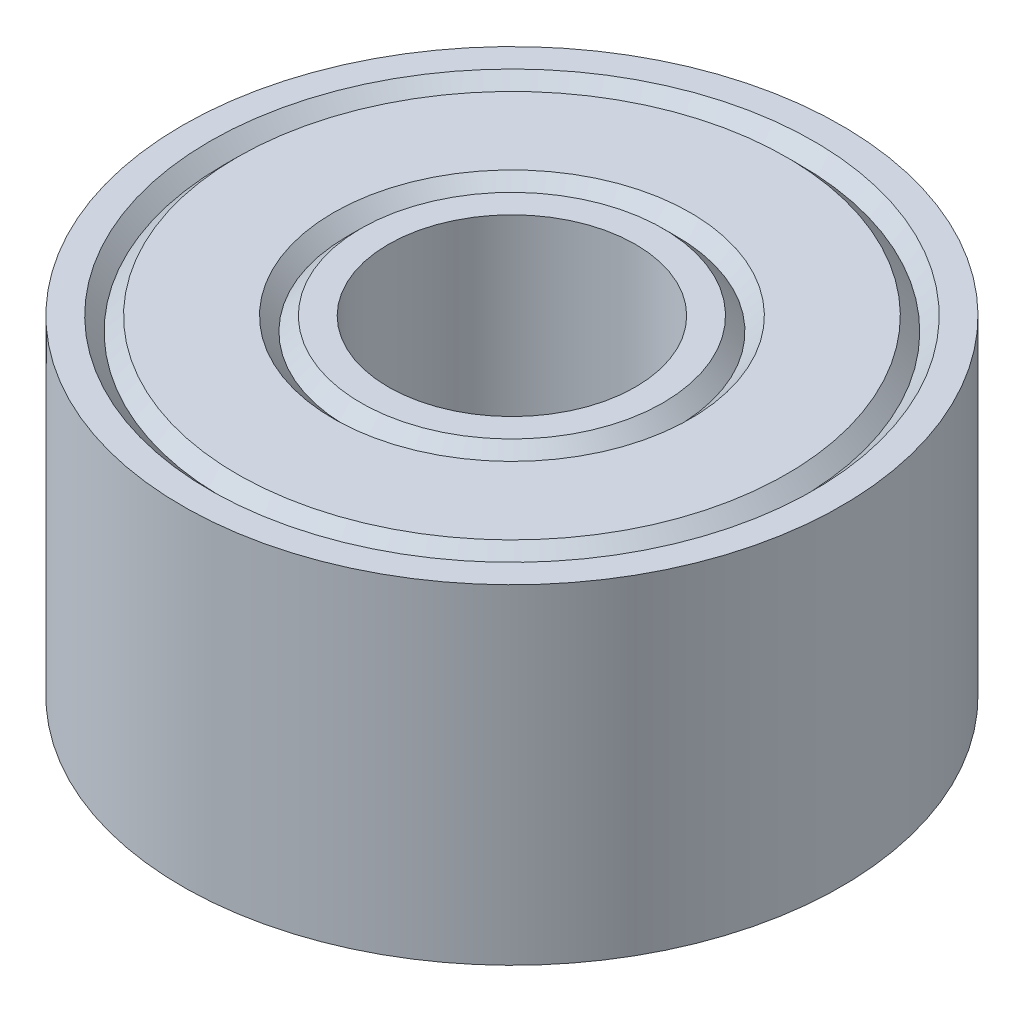
ISO-10303-21;
HEADER;
FILE_DESCRIPTION(('STEP AP214'),'2;1');
FILE_NAME('part.step','',(''),(''),'','','');
FILE_SCHEMA(('AUTOMOTIVE_DESIGN { 1 0 10303 214 1 1 1 1 }'));
ENDSEC;
DATA;
#1=APPLICATION_CONTEXT('core data for automotive mechanical design processes');
#2=APPLICATION_PROTOCOL_DEFINITION('international standard','automotive_design',2000,#1);
#3=PRODUCT_CONTEXT('',#1,'mechanical');
#4=PRODUCT('Part','Part','',(#3));
#5=PRODUCT_RELATED_PRODUCT_CATEGORY('part','',(#4));
#6=PRODUCT_DEFINITION_FORMATION('','',#4);
#7=PRODUCT_DEFINITION_CONTEXT('part definition',#1,'design');
#8=PRODUCT_DEFINITION('design','',#6,#7);
#9=PRODUCT_DEFINITION_SHAPE('','',#8);
#10=(LENGTH_UNIT() NAMED_UNIT(*) SI_UNIT(.MILLI.,.METRE.));
#11=(NAMED_UNIT(*) PLANE_ANGLE_UNIT() SI_UNIT($,.RADIAN.));
#12=(NAMED_UNIT(*) SI_UNIT($,.STERADIAN.) SOLID_ANGLE_UNIT());
#13=UNCERTAINTY_MEASURE_WITH_UNIT(LENGTH_MEASURE(1.E-05),#10,'distance_accuracy_value','');
#14=(GEOMETRIC_REPRESENTATION_CONTEXT(3) GLOBAL_UNCERTAINTY_ASSIGNED_CONTEXT((#13)) GLOBAL_UNIT_ASSIGNED_CONTEXT((#10,
#11,#12)) REPRESENTATION_CONTEXT('',''));
#15=CARTESIAN_POINT('',(0.,0.,0.));
#16=DIRECTION('',(0.,0.,1.));
#17=DIRECTION('',(1.,0.,0.));
#18=AXIS2_PLACEMENT_3D('',#15,#16,#17);
#19=CARTESIAN_POINT('',(0.,2.,0.));
#20=DIRECTION('',(0.,1.,0.));
#21=DIRECTION('',(-1.,0.,0.));
#22=AXIS2_PLACEMENT_3D('',#19,#20,#21);
#23=CYLINDRICAL_SURFACE('',#22,1.5);
#24=CARTESIAN_POINT('',(0.,2.,0.));
#25=DIRECTION('',(0.,1.,0.));
#26=DIRECTION('',(-1.,0.,0.));
#27=AXIS2_PLACEMENT_3D('',#24,#25,#26);
#28=CIRCLE('',#27,1.5);
#29=CARTESIAN_POINT('',(-1.5,2.,0.));
#30=VERTEX_POINT('',#29);
#31=EDGE_CURVE('E83',#30,#30,#28,.T.);
#32=ORIENTED_EDGE('',*,*,#31,.T.);
#33=EDGE_LOOP('',(#32));
#34=FACE_BOUND('',#33,.T.);
#35=CARTESIAN_POINT('',(0.,-2.,0.));
#36=DIRECTION('',(0.,1.,0.));
#37=DIRECTION('',(-1.,0.,0.));
#38=AXIS2_PLACEMENT_3D('',#35,#36,#37);
#39=CIRCLE('',#38,1.5);
#40=CARTESIAN_POINT('',(-1.5,-2.,0.));
#41=VERTEX_POINT('',#40);
#42=EDGE_CURVE('E10',#41,#41,#39,.T.);
#43=ORIENTED_EDGE('',*,*,#42,.F.);
#44=EDGE_LOOP('',(#43));
#45=FACE_BOUND('',#44,.T.);
#46=ADVANCED_FACE('F31',(#34,#45),#23,.F.);
#47=CARTESIAN_POINT('',(-1.5,-2.,0.));
#48=DIRECTION('',(0.,-1.,0.));
#49=DIRECTION('',(1.,0.,0.));
#50=AXIS2_PLACEMENT_3D('',#47,#48,#49);
#51=PLANE('',#50);
#52=ORIENTED_EDGE('',*,*,#42,.T.);
#53=EDGE_LOOP('',(#52));
#54=FACE_BOUND('',#53,.T.);
#55=CARTESIAN_POINT('',(0.,-2.,0.));
#56=DIRECTION('',(0.,1.,0.));
#57=DIRECTION('',(-1.,0.,0.));
#58=AXIS2_PLACEMENT_3D('',#55,#56,#57);
#59=CIRCLE('',#58,1.83333333333333);
#60=CARTESIAN_POINT('',(-1.83333333333333,-2.,0.));
#61=VERTEX_POINT('',#60);
#62=EDGE_CURVE('E37',#61,#61,#59,.T.);
#63=ORIENTED_EDGE('',*,*,#62,.F.);
#64=EDGE_LOOP('',(#63));
#65=FACE_BOUND('',#64,.T.);
#66=ADVANCED_FACE('F101',(#54,#65),#51,.T.);
#67=CARTESIAN_POINT('',(0.,-1.83333333333333,0.));
#68=DIRECTION('',(0.,1.,0.));
#69=DIRECTION('',(-1.,0.,0.));
#70=AXIS2_PLACEMENT_3D('',#67,#68,#69);
#71=CONICAL_SURFACE('',#70,2.,0.785398163397452);
#72=ORIENTED_EDGE('',*,*,#62,.T.);
#73=EDGE_LOOP('',(#72));
#74=FACE_BOUND('',#73,.T.);
#75=CARTESIAN_POINT('',(0.,-1.83333333333333,0.));
#76=DIRECTION('',(0.,1.,0.));
#77=DIRECTION('',(-1.,0.,0.));
#78=AXIS2_PLACEMENT_3D('',#75,#76,#77);
#79=CIRCLE('',#78,2.);
#80=CARTESIAN_POINT('',(-2.,-1.83333333333333,0.));
#81=VERTEX_POINT('',#80);
#82=EDGE_CURVE('E41',#81,#81,#79,.T.);
#83=ORIENTED_EDGE('',*,*,#82,.F.);
#84=EDGE_LOOP('',(#83));
#85=FACE_BOUND('',#84,.T.);
#86=ADVANCED_FACE('F105',(#74,#85),#71,.T.);
#87=CARTESIAN_POINT('',(0.,-2.,0.));
#88=DIRECTION('',(0.,-1.,0.));
#89=DIRECTION('',(1.,0.,0.));
#90=AXIS2_PLACEMENT_3D('',#87,#88,#89);
#91=CONICAL_SURFACE('',#90,2.16666666666667,0.785398163397439);
#92=ORIENTED_EDGE('',*,*,#82,.T.);
#93=EDGE_LOOP('',(#92));
#94=FACE_BOUND('',#93,.T.);
#95=CARTESIAN_POINT('',(0.,-2.,0.));
#96=DIRECTION('',(0.,1.,0.));
#97=DIRECTION('',(-1.,0.,0.));
#98=AXIS2_PLACEMENT_3D('',#95,#96,#97);
#99=CIRCLE('',#98,2.16666666666667);
#100=CARTESIAN_POINT('',(-2.16666666666667,-2.,0.));
#101=VERTEX_POINT('',#100);
#102=EDGE_CURVE('E45',#101,#101,#99,.T.);
#103=ORIENTED_EDGE('',*,*,#102,.F.);
#104=EDGE_LOOP('',(#103));
#105=FACE_BOUND('',#104,.T.);
#106=ADVANCED_FACE('F109',(#94,#105),#91,.F.);
#107=CARTESIAN_POINT('',(-2.16666666666667,-2.,0.));
#108=DIRECTION('',(0.,-1.,0.));
#109=DIRECTION('',(1.,0.,0.));
#110=AXIS2_PLACEMENT_3D('',#107,#108,#109);
#111=PLANE('',#110);
#112=ORIENTED_EDGE('',*,*,#102,.T.);
#113=EDGE_LOOP('',(#112));
#114=FACE_BOUND('',#113,.T.);
#115=CARTESIAN_POINT('',(0.,-2.,0.));
#116=DIRECTION('',(0.,1.,0.));
#117=DIRECTION('',(-1.,0.,0.));
#118=AXIS2_PLACEMENT_3D('',#115,#116,#117);
#119=CIRCLE('',#118,3.33333333333333);
#120=CARTESIAN_POINT('',(-3.33333333333333,-2.,0.));
#121=VERTEX_POINT('',#120);
#122=EDGE_CURVE('E50',#121,#121,#119,.T.);
#123=ORIENTED_EDGE('',*,*,#122,.F.);
#124=EDGE_LOOP('',(#123));
#125=FACE_BOUND('',#124,.T.);
#126=ADVANCED_FACE('F115',(#114,#125),#111,.T.);
#127=CARTESIAN_POINT('',(0.,-1.83333333333333,0.));
#128=DIRECTION('',(0.,1.,0.));
#129=DIRECTION('',(-1.,0.,0.));
#130=AXIS2_PLACEMENT_3D('',#127,#128,#129);
#131=CONICAL_SURFACE('',#130,3.5,0.785398163397448);
#132=ORIENTED_EDGE('',*,*,#122,.T.);
#133=EDGE_LOOP('',(#132));
#134=FACE_BOUND('',#133,.T.);
#135=CARTESIAN_POINT('',(0.,-1.83333333333333,0.));
#136=DIRECTION('',(0.,1.,0.));
#137=DIRECTION('',(-1.,0.,0.));
#138=AXIS2_PLACEMENT_3D('',#135,#136,#137);
#139=CIRCLE('',#138,3.5);
#140=CARTESIAN_POINT('',(-3.5,-1.83333333333333,0.));
#141=VERTEX_POINT('',#140);
#142=EDGE_CURVE('E53',#141,#141,#139,.T.);
#143=ORIENTED_EDGE('',*,*,#142,.F.);
#144=EDGE_LOOP('',(#143));
#145=FACE_BOUND('',#144,.T.);
#146=ADVANCED_FACE('F119',(#134,#145),#131,.T.);
#147=CARTESIAN_POINT('',(0.,-2.,0.));
#148=DIRECTION('',(0.,-1.,0.));
#149=DIRECTION('',(1.,0.,0.));
#150=AXIS2_PLACEMENT_3D('',#147,#148,#149);
#151=CONICAL_SURFACE('',#150,3.66666666666667,0.78539816339745);
#152=ORIENTED_EDGE('',*,*,#142,.T.);
#153=EDGE_LOOP('',(#152));
#154=FACE_BOUND('',#153,.T.);
#155=CARTESIAN_POINT('',(0.,-2.,0.));
#156=DIRECTION('',(0.,1.,0.));
#157=DIRECTION('',(-1.,0.,0.));
#158=AXIS2_PLACEMENT_3D('',#155,#156,#157);
#159=CIRCLE('',#158,3.66666666666667);
#160=CARTESIAN_POINT('',(-3.66666666666667,-2.,0.));
#161=VERTEX_POINT('',#160);
#162=EDGE_CURVE('E56',#161,#161,#159,.T.);
#163=ORIENTED_EDGE('',*,*,#162,.F.);
#164=EDGE_LOOP('',(#163));
#165=FACE_BOUND('',#164,.T.);
#166=ADVANCED_FACE('F123',(#154,#165),#151,.F.);
#167=CARTESIAN_POINT('',(-3.66666666666667,-2.,0.));
#168=DIRECTION('',(0.,-1.,0.));
#169=DIRECTION('',(1.,0.,0.));
#170=AXIS2_PLACEMENT_3D('',#167,#168,#169);
#171=PLANE('',#170);
#172=ORIENTED_EDGE('',*,*,#162,.T.);
#173=EDGE_LOOP('',(#172));
#174=FACE_BOUND('',#173,.T.);
#175=CARTESIAN_POINT('',(0.,-2.,0.));
#176=DIRECTION('',(0.,1.,0.));
#177=DIRECTION('',(-1.,0.,0.));
#178=AXIS2_PLACEMENT_3D('',#175,#176,#177);
#179=CIRCLE('',#178,4.);
#180=CARTESIAN_POINT('',(-4.,-2.,0.));
#181=VERTEX_POINT('',#180);
#182=EDGE_CURVE('E59',#181,#181,#179,.T.);
#183=ORIENTED_EDGE('',*,*,#182,.F.);
#184=EDGE_LOOP('',(#183));
#185=FACE_BOUND('',#184,.T.);
#186=ADVANCED_FACE('F127',(#174,#185),#171,.T.);
#187=CARTESIAN_POINT('',(0.,2.,0.));
#188=DIRECTION('',(0.,1.,0.));
#189=DIRECTION('',(-1.,0.,0.));
#190=AXIS2_PLACEMENT_3D('',#187,#188,#189);
#191=CYLINDRICAL_SURFACE('',#190,4.);
#192=ORIENTED_EDGE('',*,*,#182,.T.);
#193=EDGE_LOOP('',(#192));
#194=FACE_BOUND('',#193,.T.);
#195=CARTESIAN_POINT('',(0.,2.,0.));
#196=DIRECTION('',(0.,1.,0.));
#197=DIRECTION('',(-1.,0.,0.));
#198=AXIS2_PLACEMENT_3D('',#195,#196,#197);
#199=CIRCLE('',#198,4.);
#200=CARTESIAN_POINT('',(-4.,2.,0.));
#201=VERTEX_POINT('',#200);
#202=EDGE_CURVE('E62',#201,#201,#199,.T.);
#203=ORIENTED_EDGE('',*,*,#202,.F.);
#204=EDGE_LOOP('',(#203));
#205=FACE_BOUND('',#204,.T.);
#206=ADVANCED_FACE('F131',(#194,#205),#191,.T.);
#207=CARTESIAN_POINT('',(-3.66666666666667,2.,0.));
#208=DIRECTION('',(0.,1.,0.));
#209=DIRECTION('',(-1.,0.,0.));
#210=AXIS2_PLACEMENT_3D('',#207,#208,#209);
#211=PLANE('',#210);
#212=ORIENTED_EDGE('',*,*,#202,.T.);
#213=EDGE_LOOP('',(#212));
#214=FACE_BOUND('',#213,.T.);
#215=CARTESIAN_POINT('',(0.,2.,0.));
#216=DIRECTION('',(0.,1.,0.));
#217=DIRECTION('',(-1.,0.,0.));
#218=AXIS2_PLACEMENT_3D('',#215,#216,#217);
#219=CIRCLE('',#218,3.66666666666667);
#220=CARTESIAN_POINT('',(-3.66666666666667,2.,0.));
#221=VERTEX_POINT('',#220);
#222=EDGE_CURVE('E65',#221,#221,#219,.T.);
#223=ORIENTED_EDGE('',*,*,#222,.F.);
#224=EDGE_LOOP('',(#223));
#225=FACE_BOUND('',#224,.T.);
#226=ADVANCED_FACE('F135',(#214,#225),#211,.T.);
#227=CARTESIAN_POINT('',(0.,1.83333333333333,0.));
#228=DIRECTION('',(0.,1.,0.));
#229=DIRECTION('',(-1.,0.,0.));
#230=AXIS2_PLACEMENT_3D('',#227,#228,#229);
#231=CONICAL_SURFACE('',#230,3.5,0.785398163397453);
#232=ORIENTED_EDGE('',*,*,#222,.T.);
#233=EDGE_LOOP('',(#232));
#234=FACE_BOUND('',#233,.T.);
#235=CARTESIAN_POINT('',(0.,1.83333333333333,0.));
#236=DIRECTION('',(0.,1.,0.));
#237=DIRECTION('',(-1.,0.,0.));
#238=AXIS2_PLACEMENT_3D('',#235,#236,#237);
#239=CIRCLE('',#238,3.5);
#240=CARTESIAN_POINT('',(-3.5,1.83333333333333,0.));
#241=VERTEX_POINT('',#240);
#242=EDGE_CURVE('E68',#241,#241,#239,.T.);
#243=ORIENTED_EDGE('',*,*,#242,.F.);
#244=EDGE_LOOP('',(#243));
#245=FACE_BOUND('',#244,.T.);
#246=ADVANCED_FACE('F139',(#234,#245),#231,.F.);
#247=CARTESIAN_POINT('',(0.,2.,0.));
#248=DIRECTION('',(0.,-1.,0.));
#249=DIRECTION('',(1.,0.,0.));
#250=AXIS2_PLACEMENT_3D('',#247,#248,#249);
#251=CONICAL_SURFACE('',#250,3.33333333333333,0.785398163397452);
#252=ORIENTED_EDGE('',*,*,#242,.T.);
#253=EDGE_LOOP('',(#252));
#254=FACE_BOUND('',#253,.T.);
#255=CARTESIAN_POINT('',(0.,2.,0.));
#256=DIRECTION('',(0.,1.,0.));
#257=DIRECTION('',(-1.,0.,0.));
#258=AXIS2_PLACEMENT_3D('',#255,#256,#257);
#259=CIRCLE('',#258,3.33333333333333);
#260=CARTESIAN_POINT('',(-3.33333333333333,2.,0.));
#261=VERTEX_POINT('',#260);
#262=EDGE_CURVE('E71',#261,#261,#259,.T.);
#263=ORIENTED_EDGE('',*,*,#262,.F.);
#264=EDGE_LOOP('',(#263));
#265=FACE_BOUND('',#264,.T.);
#266=ADVANCED_FACE('F143',(#254,#265),#251,.T.);
#267=CARTESIAN_POINT('',(-2.16666666666667,2.,0.));
#268=DIRECTION('',(0.,1.,0.));
#269=DIRECTION('',(-1.,0.,0.));
#270=AXIS2_PLACEMENT_3D('',#267,#268,#269);
#271=PLANE('',#270);
#272=ORIENTED_EDGE('',*,*,#262,.T.);
#273=EDGE_LOOP('',(#272));
#274=FACE_BOUND('',#273,.T.);
#275=CARTESIAN_POINT('',(0.,2.,0.));
#276=DIRECTION('',(0.,1.,0.));
#277=DIRECTION('',(-1.,0.,0.));
#278=AXIS2_PLACEMENT_3D('',#275,#276,#277);
#279=CIRCLE('',#278,2.16666666666667);
#280=CARTESIAN_POINT('',(-2.16666666666667,2.,0.));
#281=VERTEX_POINT('',#280);
#282=EDGE_CURVE('E74',#281,#281,#279,.T.);
#283=ORIENTED_EDGE('',*,*,#282,.F.);
#284=EDGE_LOOP('',(#283));
#285=FACE_BOUND('',#284,.T.);
#286=ADVANCED_FACE('F147',(#274,#285),#271,.T.);
#287=CARTESIAN_POINT('',(0.,1.83333333333333,0.));
#288=DIRECTION('',(0.,1.,0.));
#289=DIRECTION('',(-1.,0.,0.));
#290=AXIS2_PLACEMENT_3D('',#287,#288,#289);
#291=CONICAL_SURFACE('',#290,2.,0.785398163397441);
#292=ORIENTED_EDGE('',*,*,#282,.T.);
#293=EDGE_LOOP('',(#292));
#294=FACE_BOUND('',#293,.T.);
#295=CARTESIAN_POINT('',(0.,1.83333333333333,0.));
#296=DIRECTION('',(0.,1.,0.));
#297=DIRECTION('',(-1.,0.,0.));
#298=AXIS2_PLACEMENT_3D('',#295,#296,#297);
#299=CIRCLE('',#298,2.);
#300=CARTESIAN_POINT('',(-2.,1.83333333333333,0.));
#301=VERTEX_POINT('',#300);
#302=EDGE_CURVE('E77',#301,#301,#299,.T.);
#303=ORIENTED_EDGE('',*,*,#302,.F.);
#304=EDGE_LOOP('',(#303));
#305=FACE_BOUND('',#304,.T.);
#306=ADVANCED_FACE('F97',(#294,#305),#291,.F.);
#307=CARTESIAN_POINT('',(0.,2.,0.));
#308=DIRECTION('',(0.,-1.,0.));
#309=DIRECTION('',(1.,0.,0.));
#310=AXIS2_PLACEMENT_3D('',#307,#308,#309);
#311=CONICAL_SURFACE('',#310,1.83333333333333,0.785398163397448);
#312=ORIENTED_EDGE('',*,*,#302,.T.);
#313=EDGE_LOOP('',(#312));
#314=FACE_BOUND('',#313,.T.);
#315=CARTESIAN_POINT('',(0.,2.,0.));
#316=DIRECTION('',(0.,1.,0.));
#317=DIRECTION('',(-1.,0.,0.));
#318=AXIS2_PLACEMENT_3D('',#315,#316,#317);
#319=CIRCLE('',#318,1.83333333333333);
#320=CARTESIAN_POINT('',(-1.83333333333333,2.,0.));
#321=VERTEX_POINT('',#320);
#322=EDGE_CURVE('E80',#321,#321,#319,.T.);
#323=ORIENTED_EDGE('',*,*,#322,.F.);
#324=EDGE_LOOP('',(#323));
#325=FACE_BOUND('',#324,.T.);
#326=ADVANCED_FACE('F91',(#314,#325),#311,.T.);
#327=CARTESIAN_POINT('',(-1.5,2.,0.));
#328=DIRECTION('',(0.,1.,0.));
#329=DIRECTION('',(-1.,0.,0.));
#330=AXIS2_PLACEMENT_3D('',#327,#328,#329);
#331=PLANE('',#330);
#332=ORIENTED_EDGE('',*,*,#322,.T.);
#333=EDGE_LOOP('',(#332));
#334=FACE_BOUND('',#333,.T.);
#335=ORIENTED_EDGE('',*,*,#31,.F.);
#336=EDGE_LOOP('',(#335));
#337=FACE_BOUND('',#336,.T.);
#338=ADVANCED_FACE('F89',(#334,#337),#331,.T.);
#339=CLOSED_SHELL('',(#46,#66,#86,#106,#126,#146,#166,#186,#206,#226,#246,#266,#286,#306,#326,#338));
#340=MANIFOLD_SOLID_BREP('B2',#339);
#341=ADVANCED_BREP_SHAPE_REPRESENTATION('',(#18,#340),#14);
#342=SHAPE_DEFINITION_REPRESENTATION(#9,#341);
ENDSEC;
END-ISO-10303-21;
